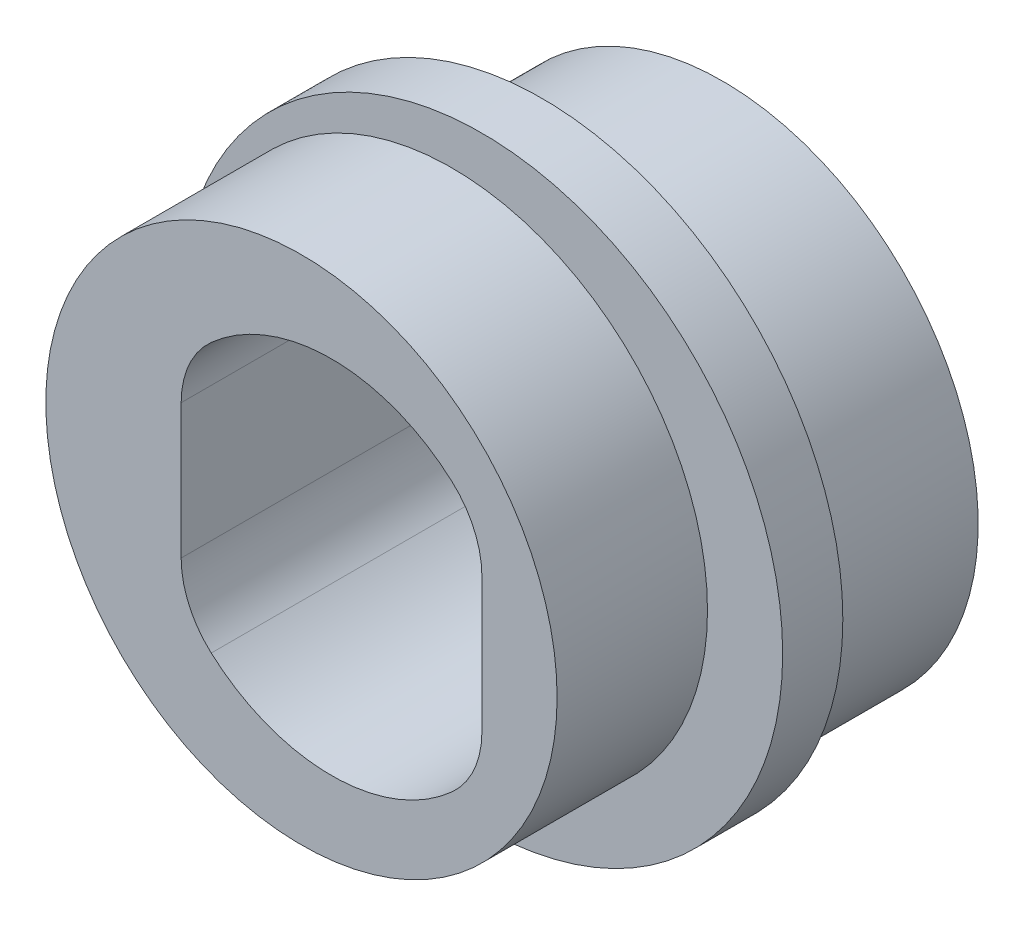
ISO-10303-21;
HEADER;
FILE_DESCRIPTION(('STEP AP214'),'2;1');
FILE_NAME('part.step','',(''),(''),'','','');
FILE_SCHEMA(('AUTOMOTIVE_DESIGN { 1 0 10303 214 1 1 1 1 }'));
ENDSEC;
DATA;
#1=APPLICATION_CONTEXT('core data for automotive mechanical design processes');
#2=APPLICATION_PROTOCOL_DEFINITION('international standard','automotive_design',2000,#1);
#3=PRODUCT_CONTEXT('',#1,'mechanical');
#4=PRODUCT('Part','Part','',(#3));
#5=PRODUCT_RELATED_PRODUCT_CATEGORY('part','',(#4));
#6=PRODUCT_DEFINITION_FORMATION('','',#4);
#7=PRODUCT_DEFINITION_CONTEXT('part definition',#1,'design');
#8=PRODUCT_DEFINITION('design','',#6,#7);
#9=PRODUCT_DEFINITION_SHAPE('','',#8);
#10=(LENGTH_UNIT() NAMED_UNIT(*) SI_UNIT(.MILLI.,.METRE.));
#11=(NAMED_UNIT(*) PLANE_ANGLE_UNIT() SI_UNIT($,.RADIAN.));
#12=(NAMED_UNIT(*) SI_UNIT($,.STERADIAN.) SOLID_ANGLE_UNIT());
#13=UNCERTAINTY_MEASURE_WITH_UNIT(LENGTH_MEASURE(1.E-05),#10,'distance_accuracy_value','');
#14=(GEOMETRIC_REPRESENTATION_CONTEXT(3) GLOBAL_UNCERTAINTY_ASSIGNED_CONTEXT((#13)) GLOBAL_UNIT_ASSIGNED_CONTEXT((#10,
#11,#12)) REPRESENTATION_CONTEXT('',''));
#15=CARTESIAN_POINT('',(0.,0.,0.));
#16=DIRECTION('',(0.,0.,1.));
#17=DIRECTION('',(1.,0.,0.));
#18=AXIS2_PLACEMENT_3D('',#15,#16,#17);
#19=CARTESIAN_POINT('',(-1.,0.,5.));
#20=DIRECTION('',(0.,0.,1.));
#21=DIRECTION('',(1.,0.,0.));
#22=AXIS2_PLACEMENT_3D('',#19,#20,#21);
#23=PLANE('',#22);
#24=CARTESIAN_POINT('',(-1.,0.,5.));
#25=DIRECTION('',(0.,0.,1.));
#26=DIRECTION('',(1.,0.,0.));
#27=AXIS2_PLACEMENT_3D('',#24,#25,#26);
#28=CIRCLE('',#27,8.5);
#29=CARTESIAN_POINT('',(7.5,0.,5.));
#30=VERTEX_POINT('',#29);
#31=EDGE_CURVE('E133',#30,#30,#28,.T.);
#32=ORIENTED_EDGE('',*,*,#31,.T.);
#33=EDGE_LOOP('',(#32));
#34=FACE_BOUND('',#33,.T.);
#35=DIRECTION('',(0.,-1.,0.));
#36=VECTOR('',#35,1.);
#37=CARTESIAN_POINT('',(-5.,-3.3166247903554,5.));
#38=LINE('',#37,#36);
#39=CARTESIAN_POINT('',(-5.,2.23606797749979,5.));
#40=VERTEX_POINT('',#39);
#41=CARTESIAN_POINT('',(-5.,-2.23606797749979,5.));
#42=VERTEX_POINT('',#41);
#43=EDGE_CURVE('E193',#40,#42,#38,.T.);
#44=ORIENTED_EDGE('',*,*,#43,.F.);
#45=CARTESIAN_POINT('',(-2.,2.23606797749979,5.));
#46=DIRECTION('',(0.,0.,1.));
#47=DIRECTION('',(1.,0.,0.));
#48=AXIS2_PLACEMENT_3D('',#45,#46,#47);
#49=CIRCLE('',#48,3.);
#50=CARTESIAN_POINT('',(-4.,4.47213595499958,5.));
#51=VERTEX_POINT('',#50);
#52=EDGE_CURVE('E11',#40,#51,#49,.F.);
#53=ORIENTED_EDGE('',*,*,#52,.T.);
#54=CARTESIAN_POINT('',(0.,0.,5.));
#55=DIRECTION('',(0.,0.,1.));
#56=DIRECTION('',(1.,0.,0.));
#57=AXIS2_PLACEMENT_3D('',#54,#55,#56);
#58=CIRCLE('',#57,6.);
#59=CARTESIAN_POINT('',(4.,4.47213595499958,5.));
#60=VERTEX_POINT('',#59);
#61=EDGE_CURVE('E191',#60,#51,#58,.T.);
#62=ORIENTED_EDGE('',*,*,#61,.F.);
#63=CARTESIAN_POINT('',(2.,2.23606797749979,5.));
#64=DIRECTION('',(0.,0.,1.));
#65=DIRECTION('',(1.,0.,0.));
#66=AXIS2_PLACEMENT_3D('',#63,#64,#65);
#67=CIRCLE('',#66,3.);
#68=CARTESIAN_POINT('',(5.,2.23606797749979,5.));
#69=VERTEX_POINT('',#68);
#70=EDGE_CURVE('E117',#60,#69,#67,.F.);
#71=ORIENTED_EDGE('',*,*,#70,.T.);
#72=DIRECTION('',(0.,1.,0.));
#73=VECTOR('',#72,1.);
#74=CARTESIAN_POINT('',(5.,-3.3166247903554,5.));
#75=LINE('',#74,#73);
#76=CARTESIAN_POINT('',(5.,-2.23606797749979,5.));
#77=VERTEX_POINT('',#76);
#78=EDGE_CURVE('E210',#77,#69,#75,.T.);
#79=ORIENTED_EDGE('',*,*,#78,.F.);
#80=CARTESIAN_POINT('',(2.,-2.23606797749979,5.));
#81=DIRECTION('',(0.,0.,1.));
#82=DIRECTION('',(1.,0.,0.));
#83=AXIS2_PLACEMENT_3D('',#80,#81,#82);
#84=CIRCLE('',#83,3.);
#85=CARTESIAN_POINT('',(4.,-4.47213595499958,5.));
#86=VERTEX_POINT('',#85);
#87=EDGE_CURVE('E116',#77,#86,#84,.F.);
#88=ORIENTED_EDGE('',*,*,#87,.T.);
#89=CARTESIAN_POINT('',(0.,0.,5.));
#90=DIRECTION('',(0.,0.,1.));
#91=DIRECTION('',(1.,0.,0.));
#92=AXIS2_PLACEMENT_3D('',#89,#90,#91);
#93=CIRCLE('',#92,6.);
#94=CARTESIAN_POINT('',(-4.,-4.47213595499958,5.));
#95=VERTEX_POINT('',#94);
#96=EDGE_CURVE('E202',#95,#86,#93,.T.);
#97=ORIENTED_EDGE('',*,*,#96,.F.);
#98=CARTESIAN_POINT('',(-2.,-2.23606797749979,5.));
#99=DIRECTION('',(0.,0.,1.));
#100=DIRECTION('',(1.,0.,0.));
#101=AXIS2_PLACEMENT_3D('',#98,#99,#100);
#102=CIRCLE('',#101,3.);
#103=EDGE_CURVE('E52',#95,#42,#102,.F.);
#104=ORIENTED_EDGE('',*,*,#103,.T.);
#105=EDGE_LOOP('',(#44,#53,#62,#71,#79,#88,#97,#104));
#106=FACE_BOUND('',#105,.T.);
#107=ADVANCED_FACE('F36',(#34,#106),#23,.T.);
#108=CARTESIAN_POINT('',(-1.,0.,5.));
#109=DIRECTION('',(0.,0.,-1.));
#110=DIRECTION('',(-1.,0.,0.));
#111=AXIS2_PLACEMENT_3D('',#108,#109,#110);
#112=CYLINDRICAL_SURFACE('',#111,8.5);
#113=ORIENTED_EDGE('',*,*,#31,.F.);
#114=EDGE_LOOP('',(#113));
#115=FACE_BOUND('',#114,.T.);
#116=CARTESIAN_POINT('',(-1.,0.,0.));
#117=DIRECTION('',(0.,0.,1.));
#118=DIRECTION('',(1.,0.,0.));
#119=AXIS2_PLACEMENT_3D('',#116,#117,#118);
#120=CIRCLE('',#119,8.5);
#121=CARTESIAN_POINT('',(7.5,0.,0.));
#122=VERTEX_POINT('',#121);
#123=EDGE_CURVE('E141',#122,#122,#120,.T.);
#124=ORIENTED_EDGE('',*,*,#123,.T.);
#125=EDGE_LOOP('',(#124));
#126=FACE_BOUND('',#125,.T.);
#127=ADVANCED_FACE('F217',(#115,#126),#112,.T.);
#128=CARTESIAN_POINT('',(0.,0.,5.));
#129=DIRECTION('',(0.,0.,-1.));
#130=DIRECTION('',(-1.,0.,0.));
#131=AXIS2_PLACEMENT_3D('',#128,#129,#130);
#132=CYLINDRICAL_SURFACE('',#131,6.);
#133=CARTESIAN_POINT('',(0.,0.,-7.));
#134=DIRECTION('',(0.,0.,1.));
#135=DIRECTION('',(1.,0.,0.));
#136=AXIS2_PLACEMENT_3D('',#133,#134,#135);
#137=CIRCLE('',#136,6.);
#138=CARTESIAN_POINT('',(4.,4.47213595499958,-7.));
#139=VERTEX_POINT('',#138);
#140=CARTESIAN_POINT('',(-4.,4.47213595499958,-7.));
#141=VERTEX_POINT('',#140);
#142=EDGE_CURVE('E128',#139,#141,#137,.T.);
#143=ORIENTED_EDGE('',*,*,#142,.F.);
#144=DIRECTION('',(0.,0.,-1.));
#145=VECTOR('',#144,1.);
#146=CARTESIAN_POINT('',(4.,4.47213595499958,5.));
#147=LINE('',#146,#145);
#148=EDGE_CURVE('E150',#139,#60,#147,.F.);
#149=ORIENTED_EDGE('',*,*,#148,.T.);
#150=ORIENTED_EDGE('',*,*,#61,.T.);
#151=DIRECTION('',(0.,0.,-1.));
#152=VECTOR('',#151,1.);
#153=CARTESIAN_POINT('',(-4.,4.47213595499958,5.));
#154=LINE('',#153,#152);
#155=EDGE_CURVE('E137',#51,#141,#154,.T.);
#156=ORIENTED_EDGE('',*,*,#155,.T.);
#157=EDGE_LOOP('',(#143,#149,#150,#156));
#158=FACE_BOUND('',#157,.T.);
#159=ADVANCED_FACE('F195',(#158),#132,.F.);
#160=CARTESIAN_POINT('',(-5.,-3.3166247903554,5.));
#161=DIRECTION('',(1.,0.,0.));
#162=DIRECTION('',(0.,0.,-1.));
#163=AXIS2_PLACEMENT_3D('',#160,#161,#162);
#164=PLANE('',#163);
#165=ORIENTED_EDGE('',*,*,#43,.T.);
#166=DIRECTION('',(0.,0.,1.));
#167=VECTOR('',#166,1.);
#168=CARTESIAN_POINT('',(-5.,-2.23606797749979,-7.));
#169=LINE('',#168,#167);
#170=CARTESIAN_POINT('',(-5.,-2.23606797749979,-7.));
#171=VERTEX_POINT('',#170);
#172=EDGE_CURVE('E161',#42,#171,#169,.F.);
#173=ORIENTED_EDGE('',*,*,#172,.T.);
#174=DIRECTION('',(0.,-1.,0.));
#175=VECTOR('',#174,1.);
#176=CARTESIAN_POINT('',(-5.,3.3166247903554,-7.));
#177=LINE('',#176,#175);
#178=CARTESIAN_POINT('',(-5.,2.23606797749979,-7.));
#179=VERTEX_POINT('',#178);
#180=EDGE_CURVE('E179',#179,#171,#177,.T.);
#181=ORIENTED_EDGE('',*,*,#180,.F.);
#182=DIRECTION('',(0.,0.,1.));
#183=VECTOR('',#182,1.);
#184=CARTESIAN_POINT('',(-5.,2.23606797749979,5.));
#185=LINE('',#184,#183);
#186=EDGE_CURVE('E59',#179,#40,#185,.T.);
#187=ORIENTED_EDGE('',*,*,#186,.T.);
#188=EDGE_LOOP('',(#165,#173,#181,#187));
#189=FACE_BOUND('',#188,.T.);
#190=ADVANCED_FACE('F183',(#189),#164,.T.);
#191=CARTESIAN_POINT('',(0.,0.,5.));
#192=DIRECTION('',(0.,0.,-1.));
#193=DIRECTION('',(-1.,0.,0.));
#194=AXIS2_PLACEMENT_3D('',#191,#192,#193);
#195=CYLINDRICAL_SURFACE('',#194,6.);
#196=ORIENTED_EDGE('',*,*,#96,.T.);
#197=DIRECTION('',(0.,0.,-1.));
#198=VECTOR('',#197,1.);
#199=CARTESIAN_POINT('',(4.,-4.47213595499958,5.));
#200=LINE('',#199,#198);
#201=CARTESIAN_POINT('',(4.,-4.47213595499958,-7.));
#202=VERTEX_POINT('',#201);
#203=EDGE_CURVE('E156',#86,#202,#200,.T.);
#204=ORIENTED_EDGE('',*,*,#203,.T.);
#205=CARTESIAN_POINT('',(0.,0.,-7.));
#206=DIRECTION('',(0.,0.,1.));
#207=DIRECTION('',(1.,0.,0.));
#208=AXIS2_PLACEMENT_3D('',#205,#206,#207);
#209=CIRCLE('',#208,6.);
#210=CARTESIAN_POINT('',(-4.,-4.47213595499958,-7.));
#211=VERTEX_POINT('',#210);
#212=EDGE_CURVE('E110',#211,#202,#209,.T.);
#213=ORIENTED_EDGE('',*,*,#212,.F.);
#214=DIRECTION('',(0.,0.,-1.));
#215=VECTOR('',#214,1.);
#216=CARTESIAN_POINT('',(-4.,-4.47213595499958,5.));
#217=LINE('',#216,#215);
#218=EDGE_CURVE('E153',#211,#95,#217,.F.);
#219=ORIENTED_EDGE('',*,*,#218,.T.);
#220=EDGE_LOOP('',(#196,#204,#213,#219));
#221=FACE_BOUND('',#220,.T.);
#222=ADVANCED_FACE('F287',(#221),#195,.F.);
#223=CARTESIAN_POINT('',(5.,-3.3166247903554,5.));
#224=DIRECTION('',(-1.,0.,0.));
#225=DIRECTION('',(0.,0.,1.));
#226=AXIS2_PLACEMENT_3D('',#223,#224,#225);
#227=PLANE('',#226);
#228=ORIENTED_EDGE('',*,*,#78,.T.);
#229=DIRECTION('',(0.,0.,1.));
#230=VECTOR('',#229,1.);
#231=CARTESIAN_POINT('',(5.,2.23606797749979,-7.));
#232=LINE('',#231,#230);
#233=CARTESIAN_POINT('',(5.,2.23606797749979,-7.));
#234=VERTEX_POINT('',#233);
#235=EDGE_CURVE('E126',#69,#234,#232,.F.);
#236=ORIENTED_EDGE('',*,*,#235,.T.);
#237=DIRECTION('',(0.,1.,0.));
#238=VECTOR('',#237,1.);
#239=CARTESIAN_POINT('',(5.,-3.3166247903554,-7.));
#240=LINE('',#239,#238);
#241=CARTESIAN_POINT('',(5.,-2.23606797749979,-7.));
#242=VERTEX_POINT('',#241);
#243=EDGE_CURVE('E108',#242,#234,#240,.T.);
#244=ORIENTED_EDGE('',*,*,#243,.F.);
#245=DIRECTION('',(0.,0.,1.));
#246=VECTOR('',#245,1.);
#247=CARTESIAN_POINT('',(5.,-2.23606797749979,5.));
#248=LINE('',#247,#246);
#249=EDGE_CURVE('E123',#242,#77,#248,.T.);
#250=ORIENTED_EDGE('',*,*,#249,.T.);
#251=EDGE_LOOP('',(#228,#236,#244,#250));
#252=FACE_BOUND('',#251,.T.);
#253=ADVANCED_FACE('F122',(#252),#227,.T.);
#254=CARTESIAN_POINT('',(1.,0.,0.));
#255=DIRECTION('',(0.,0.,-1.));
#256=DIRECTION('',(-1.,0.,0.));
#257=AXIS2_PLACEMENT_3D('',#254,#255,#256);
#258=PLANE('',#257);
#259=ORIENTED_EDGE('',*,*,#123,.F.);
#260=EDGE_LOOP('',(#259));
#261=FACE_BOUND('',#260,.T.);
#262=CARTESIAN_POINT('',(0.,0.,0.));
#263=DIRECTION('',(0.,0.,-1.));
#264=DIRECTION('',(-1.,0.,0.));
#265=AXIS2_PLACEMENT_3D('',#262,#263,#264);
#266=CIRCLE('',#265,10.);
#267=CARTESIAN_POINT('',(-10.,0.,0.));
#268=VERTEX_POINT('',#267);
#269=EDGE_CURVE('E225',#268,#268,#266,.T.);
#270=ORIENTED_EDGE('',*,*,#269,.F.);
#271=EDGE_LOOP('',(#270));
#272=FACE_BOUND('',#271,.T.);
#273=ADVANCED_FACE('F219',(#261,#272),#258,.F.);
#274=CARTESIAN_POINT('',(1.,0.,-7.));
#275=DIRECTION('',(0.,0.,-1.));
#276=DIRECTION('',(-1.,0.,0.));
#277=AXIS2_PLACEMENT_3D('',#274,#275,#276);
#278=PLANE('',#277);
#279=ORIENTED_EDGE('',*,*,#180,.T.);
#280=CARTESIAN_POINT('',(-2.,-2.23606797749979,-7.));
#281=DIRECTION('',(0.,0.,-1.));
#282=DIRECTION('',(-1.,0.,0.));
#283=AXIS2_PLACEMENT_3D('',#280,#281,#282);
#284=CIRCLE('',#283,3.);
#285=EDGE_CURVE('E172',#171,#211,#284,.F.);
#286=ORIENTED_EDGE('',*,*,#285,.T.);
#287=ORIENTED_EDGE('',*,*,#212,.T.);
#288=CARTESIAN_POINT('',(2.,-2.23606797749979,-7.));
#289=DIRECTION('',(0.,0.,-1.));
#290=DIRECTION('',(-1.,0.,0.));
#291=AXIS2_PLACEMENT_3D('',#288,#289,#290);
#292=CIRCLE('',#291,3.);
#293=EDGE_CURVE('E103',#202,#242,#292,.F.);
#294=ORIENTED_EDGE('',*,*,#293,.T.);
#295=ORIENTED_EDGE('',*,*,#243,.T.);
#296=CARTESIAN_POINT('',(2.,2.23606797749979,-7.));
#297=DIRECTION('',(0.,0.,-1.));
#298=DIRECTION('',(-1.,0.,0.));
#299=AXIS2_PLACEMENT_3D('',#296,#297,#298);
#300=CIRCLE('',#299,3.);
#301=EDGE_CURVE('E165',#234,#139,#300,.F.);
#302=ORIENTED_EDGE('',*,*,#301,.T.);
#303=ORIENTED_EDGE('',*,*,#142,.T.);
#304=CARTESIAN_POINT('',(-2.,2.23606797749979,-7.));
#305=DIRECTION('',(0.,0.,-1.));
#306=DIRECTION('',(-1.,0.,0.));
#307=AXIS2_PLACEMENT_3D('',#304,#305,#306);
#308=CIRCLE('',#307,3.);
#309=EDGE_CURVE('E45',#141,#179,#308,.F.);
#310=ORIENTED_EDGE('',*,*,#309,.T.);
#311=EDGE_LOOP('',(#279,#286,#287,#294,#295,#302,#303,#310));
#312=FACE_BOUND('',#311,.T.);
#313=CARTESIAN_POINT('',(1.,0.,-7.));
#314=DIRECTION('',(0.,0.,-1.));
#315=DIRECTION('',(-1.,0.,0.));
#316=AXIS2_PLACEMENT_3D('',#313,#314,#315);
#317=CIRCLE('',#316,8.5);
#318=CARTESIAN_POINT('',(-7.5,0.,-7.));
#319=VERTEX_POINT('',#318);
#320=EDGE_CURVE('E186',#319,#319,#317,.T.);
#321=ORIENTED_EDGE('',*,*,#320,.T.);
#322=EDGE_LOOP('',(#321));
#323=FACE_BOUND('',#322,.T.);
#324=ADVANCED_FACE('F106',(#312,#323),#278,.T.);
#325=CARTESIAN_POINT('',(1.,0.,-7.));
#326=DIRECTION('',(0.,0.,1.));
#327=DIRECTION('',(1.,0.,0.));
#328=AXIS2_PLACEMENT_3D('',#325,#326,#327);
#329=CYLINDRICAL_SURFACE('',#328,8.5);
#330=CARTESIAN_POINT('',(1.,0.,-2.));
#331=DIRECTION('',(0.,0.,-1.));
#332=DIRECTION('',(-1.,0.,0.));
#333=AXIS2_PLACEMENT_3D('',#330,#331,#332);
#334=CIRCLE('',#333,8.5);
#335=CARTESIAN_POINT('',(-7.5,0.,-2.));
#336=VERTEX_POINT('',#335);
#337=EDGE_CURVE('E144',#336,#336,#334,.T.);
#338=ORIENTED_EDGE('',*,*,#337,.T.);
#339=EDGE_LOOP('',(#338));
#340=FACE_BOUND('',#339,.T.);
#341=ORIENTED_EDGE('',*,*,#320,.F.);
#342=EDGE_LOOP('',(#341));
#343=FACE_BOUND('',#342,.T.);
#344=ADVANCED_FACE('F248',(#340,#343),#329,.T.);
#345=CARTESIAN_POINT('',(0.,0.,-2.));
#346=DIRECTION('',(0.,0.,-1.));
#347=DIRECTION('',(-1.,0.,0.));
#348=AXIS2_PLACEMENT_3D('',#345,#346,#347);
#349=PLANE('',#348);
#350=ORIENTED_EDGE('',*,*,#337,.F.);
#351=EDGE_LOOP('',(#350));
#352=FACE_BOUND('',#351,.T.);
#353=CARTESIAN_POINT('',(0.,0.,-2.));
#354=DIRECTION('',(0.,0.,-1.));
#355=DIRECTION('',(-1.,0.,0.));
#356=AXIS2_PLACEMENT_3D('',#353,#354,#355);
#357=CIRCLE('',#356,10.);
#358=CARTESIAN_POINT('',(-10.,0.,-2.));
#359=VERTEX_POINT('',#358);
#360=EDGE_CURVE('E228',#359,#359,#357,.T.);
#361=ORIENTED_EDGE('',*,*,#360,.T.);
#362=EDGE_LOOP('',(#361));
#363=FACE_BOUND('',#362,.T.);
#364=ADVANCED_FACE('F251',(#352,#363),#349,.T.);
#365=CARTESIAN_POINT('',(0.,0.,-2.));
#366=DIRECTION('',(0.,0.,1.));
#367=DIRECTION('',(1.,0.,0.));
#368=AXIS2_PLACEMENT_3D('',#365,#366,#367);
#369=CYLINDRICAL_SURFACE('',#368,10.);
#370=ORIENTED_EDGE('',*,*,#360,.F.);
#371=EDGE_LOOP('',(#370));
#372=FACE_BOUND('',#371,.T.);
#373=ORIENTED_EDGE('',*,*,#269,.T.);
#374=EDGE_LOOP('',(#373));
#375=FACE_BOUND('',#374,.T.);
#376=ADVANCED_FACE('F254',(#372,#375),#369,.T.);
#377=CARTESIAN_POINT('',(2.,2.23606797749979,5.));
#378=DIRECTION('',(0.,0.,-1.));
#379=DIRECTION('',(-1.,0.,0.));
#380=AXIS2_PLACEMENT_3D('',#377,#378,#379);
#381=CYLINDRICAL_SURFACE('',#380,3.);
#382=ORIENTED_EDGE('',*,*,#70,.F.);
#383=ORIENTED_EDGE('',*,*,#148,.F.);
#384=ORIENTED_EDGE('',*,*,#301,.F.);
#385=ORIENTED_EDGE('',*,*,#235,.F.);
#386=EDGE_LOOP('',(#382,#383,#384,#385));
#387=FACE_BOUND('',#386,.T.);
#388=ADVANCED_FACE('F259',(#387),#381,.F.);
#389=CARTESIAN_POINT('',(2.,-2.23606797749979,5.));
#390=DIRECTION('',(0.,0.,-1.));
#391=DIRECTION('',(-1.,0.,0.));
#392=AXIS2_PLACEMENT_3D('',#389,#390,#391);
#393=CYLINDRICAL_SURFACE('',#392,3.);
#394=ORIENTED_EDGE('',*,*,#87,.F.);
#395=ORIENTED_EDGE('',*,*,#249,.F.);
#396=ORIENTED_EDGE('',*,*,#293,.F.);
#397=ORIENTED_EDGE('',*,*,#203,.F.);
#398=EDGE_LOOP('',(#394,#395,#396,#397));
#399=FACE_BOUND('',#398,.T.);
#400=ADVANCED_FACE('F131',(#399),#393,.F.);
#401=CARTESIAN_POINT('',(-2.,-2.23606797749979,5.));
#402=DIRECTION('',(0.,0.,-1.));
#403=DIRECTION('',(-1.,0.,0.));
#404=AXIS2_PLACEMENT_3D('',#401,#402,#403);
#405=CYLINDRICAL_SURFACE('',#404,3.);
#406=ORIENTED_EDGE('',*,*,#103,.F.);
#407=ORIENTED_EDGE('',*,*,#218,.F.);
#408=ORIENTED_EDGE('',*,*,#285,.F.);
#409=ORIENTED_EDGE('',*,*,#172,.F.);
#410=EDGE_LOOP('',(#406,#407,#408,#409));
#411=FACE_BOUND('',#410,.T.);
#412=ADVANCED_FACE('F279',(#411),#405,.F.);
#413=CARTESIAN_POINT('',(-2.,2.23606797749979,5.));
#414=DIRECTION('',(0.,0.,-1.));
#415=DIRECTION('',(-1.,0.,0.));
#416=AXIS2_PLACEMENT_3D('',#413,#414,#415);
#417=CYLINDRICAL_SURFACE('',#416,3.);
#418=ORIENTED_EDGE('',*,*,#52,.F.);
#419=ORIENTED_EDGE('',*,*,#186,.F.);
#420=ORIENTED_EDGE('',*,*,#309,.F.);
#421=ORIENTED_EDGE('',*,*,#155,.F.);
#422=EDGE_LOOP('',(#418,#419,#420,#421));
#423=FACE_BOUND('',#422,.T.);
#424=ADVANCED_FACE('F38',(#423),#417,.F.);
#425=CLOSED_SHELL('',(#107,#127,#159,#190,#222,#253,#273,#324,#344,#364,#376,#388,#400,#412,#424));
#426=MANIFOLD_SOLID_BREP('B2',#425);
#427=ADVANCED_BREP_SHAPE_REPRESENTATION('',(#18,#426),#14);
#428=SHAPE_DEFINITION_REPRESENTATION(#9,#427);
ENDSEC;
END-ISO-10303-21;
